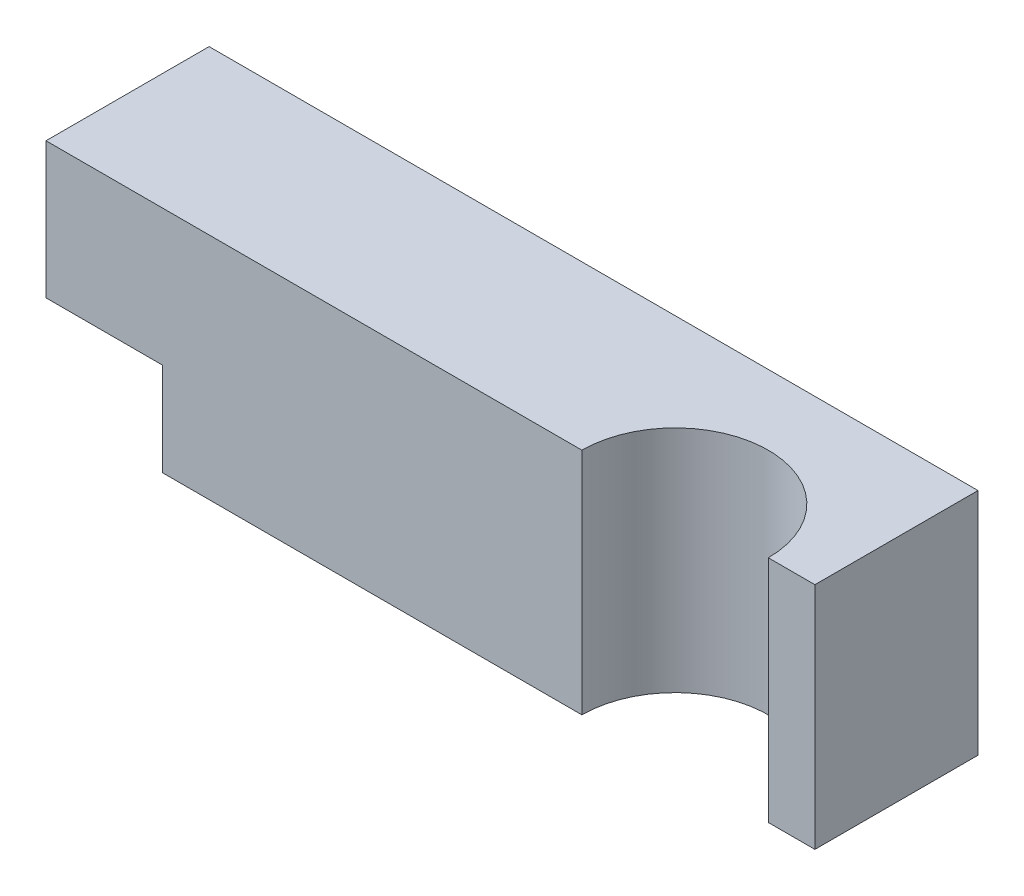
ISO-10303-21;
HEADER;
FILE_DESCRIPTION(('STEP AP214'),'2;1');
FILE_NAME('part.step','',(''),(''),'','','');
FILE_SCHEMA(('AUTOMOTIVE_DESIGN { 1 0 10303 214 1 1 1 1 }'));
ENDSEC;
DATA;
#1=APPLICATION_CONTEXT('core data for automotive mechanical design processes');
#2=APPLICATION_PROTOCOL_DEFINITION('international standard','automotive_design',2000,#1);
#3=PRODUCT_CONTEXT('',#1,'mechanical');
#4=PRODUCT('Part','Part','',(#3));
#5=PRODUCT_RELATED_PRODUCT_CATEGORY('part','',(#4));
#6=PRODUCT_DEFINITION_FORMATION('','',#4);
#7=PRODUCT_DEFINITION_CONTEXT('part definition',#1,'design');
#8=PRODUCT_DEFINITION('design','',#6,#7);
#9=PRODUCT_DEFINITION_SHAPE('','',#8);
#10=(LENGTH_UNIT() NAMED_UNIT(*) SI_UNIT(.MILLI.,.METRE.));
#11=(NAMED_UNIT(*) PLANE_ANGLE_UNIT() SI_UNIT($,.RADIAN.));
#12=(NAMED_UNIT(*) SI_UNIT($,.STERADIAN.) SOLID_ANGLE_UNIT());
#13=UNCERTAINTY_MEASURE_WITH_UNIT(LENGTH_MEASURE(1.E-05),#10,'distance_accuracy_value','');
#14=(GEOMETRIC_REPRESENTATION_CONTEXT(3) GLOBAL_UNCERTAINTY_ASSIGNED_CONTEXT((#13)) GLOBAL_UNIT_ASSIGNED_CONTEXT((#10,
#11,#12)) REPRESENTATION_CONTEXT('',''));
#15=CARTESIAN_POINT('',(0.,0.,0.));
#16=DIRECTION('',(0.,0.,1.));
#17=DIRECTION('',(1.,0.,0.));
#18=AXIS2_PLACEMENT_3D('',#15,#16,#17);
#19=CARTESIAN_POINT('',(0.,0.,3.5));
#20=DIRECTION('',(0.,0.,1.));
#21=DIRECTION('',(1.,0.,0.));
#22=AXIS2_PLACEMENT_3D('',#19,#20,#21);
#23=PLANE('',#22);
#24=DIRECTION('',(0.,1.,0.));
#25=VECTOR('',#24,1.);
#26=CARTESIAN_POINT('',(29.8815164360888,13.8846877860004,3.5));
#27=LINE('',#26,#25);
#28=CARTESIAN_POINT('',(29.8815164360888,14.9646877860004,3.5));
#29=VERTEX_POINT('',#28);
#30=CARTESIAN_POINT('',(29.8815164360888,19.8846877860004,3.5));
#31=VERTEX_POINT('',#30);
#32=EDGE_CURVE('E12',#29,#31,#27,.T.);
#33=ORIENTED_EDGE('',*,*,#32,.F.);
#34=DIRECTION('',(-1.,0.,0.));
#35=VECTOR('',#34,1.);
#36=CARTESIAN_POINT('',(30.8815164360888,14.9646877860004,3.5));
#37=LINE('',#36,#35);
#38=CARTESIAN_POINT('',(30.8815164360888,14.9646877860004,3.5));
#39=VERTEX_POINT('',#38);
#40=EDGE_CURVE('E125',#39,#29,#37,.T.);
#41=ORIENTED_EDGE('',*,*,#40,.F.);
#42=DIRECTION('',(0.,-1.,0.));
#43=VECTOR('',#42,1.);
#44=CARTESIAN_POINT('',(30.8815164360888,19.8846877860004,3.5));
#45=LINE('',#44,#43);
#46=CARTESIAN_POINT('',(30.8815164360888,19.8846877860004,3.5));
#47=VERTEX_POINT('',#46);
#48=EDGE_CURVE('E112',#47,#39,#45,.T.);
#49=ORIENTED_EDGE('',*,*,#48,.F.);
#50=DIRECTION('',(-1.,0.,0.));
#51=VECTOR('',#50,1.);
#52=CARTESIAN_POINT('',(20.7026434327298,19.8846877860004,3.5));
#53=LINE('',#52,#51);
#54=EDGE_CURVE('E102',#47,#31,#53,.T.);
#55=ORIENTED_EDGE('',*,*,#54,.T.);
#56=EDGE_LOOP('',(#33,#41,#49,#55));
#57=FACE_BOUND('',#56,.T.);
#58=ADVANCED_FACE('F33',(#57),#23,.T.);
#59=CARTESIAN_POINT('',(16.8815164360888,14.9646877860004,3.5));
#60=DIRECTION('',(-1.,0.,0.));
#61=DIRECTION('',(0.,0.,1.));
#62=AXIS2_PLACEMENT_3D('',#59,#60,#61);
#63=PLANE('',#62);
#64=DIRECTION('',(0.,1.,0.));
#65=VECTOR('',#64,1.);
#66=CARTESIAN_POINT('',(16.8815164360888,14.9646877860004,0.));
#67=LINE('',#66,#65);
#68=CARTESIAN_POINT('',(16.8815164360888,14.9646877860004,0.));
#69=VERTEX_POINT('',#68);
#70=CARTESIAN_POINT('',(16.8815164360888,16.9646877860004,0.));
#71=VERTEX_POINT('',#70);
#72=EDGE_CURVE('E130',#69,#71,#67,.T.);
#73=ORIENTED_EDGE('',*,*,#72,.F.);
#74=DIRECTION('',(0.,0.,-1.));
#75=VECTOR('',#74,1.);
#76=CARTESIAN_POINT('',(16.8815164360888,14.9646877860004,3.5));
#77=LINE('',#76,#75);
#78=CARTESIAN_POINT('',(16.8815164360888,14.9646877860004,3.5));
#79=VERTEX_POINT('',#78);
#80=EDGE_CURVE('E81',#79,#69,#77,.T.);
#81=ORIENTED_EDGE('',*,*,#80,.F.);
#82=DIRECTION('',(0.,1.,0.));
#83=VECTOR('',#82,1.);
#84=CARTESIAN_POINT('',(16.8815164360888,14.9646877860004,3.5));
#85=LINE('',#84,#83);
#86=CARTESIAN_POINT('',(16.8815164360888,16.9646877860004,3.5));
#87=VERTEX_POINT('',#86);
#88=EDGE_CURVE('E146',#79,#87,#85,.T.);
#89=ORIENTED_EDGE('',*,*,#88,.T.);
#90=DIRECTION('',(0.,0.,-1.));
#91=VECTOR('',#90,1.);
#92=CARTESIAN_POINT('',(16.8815164360888,16.9646877860004,3.5));
#93=LINE('',#92,#91);
#94=EDGE_CURVE('E89',#87,#71,#93,.T.);
#95=ORIENTED_EDGE('',*,*,#94,.T.);
#96=EDGE_LOOP('',(#73,#81,#89,#95));
#97=FACE_BOUND('',#96,.T.);
#98=ADVANCED_FACE('F35',(#97),#63,.T.);
#99=CARTESIAN_POINT('',(30.8815164360888,14.9646877860004,3.5));
#100=DIRECTION('',(0.,-1.,0.));
#101=DIRECTION('',(1.,0.,0.));
#102=AXIS2_PLACEMENT_3D('',#99,#100,#101);
#103=PLANE('',#102);
#104=CARTESIAN_POINT('',(27.8815164360888,14.9646877860004,3.5));
#105=DIRECTION('',(0.,-1.,0.));
#106=DIRECTION('',(1.,0.,0.));
#107=AXIS2_PLACEMENT_3D('',#104,#105,#106);
#108=CIRCLE('',#107,2.);
#109=CARTESIAN_POINT('',(25.8815164360888,14.9646877860004,3.5));
#110=VERTEX_POINT('',#109);
#111=EDGE_CURVE('E134',#110,#29,#108,.T.);
#112=ORIENTED_EDGE('',*,*,#111,.F.);
#113=EDGE_CURVE('E56',#110,#79,#37,.T.);
#114=ORIENTED_EDGE('',*,*,#113,.T.);
#115=ORIENTED_EDGE('',*,*,#80,.T.);
#116=DIRECTION('',(-1.,0.,0.));
#117=VECTOR('',#116,1.);
#118=CARTESIAN_POINT('',(30.8815164360888,14.9646877860004,0.));
#119=LINE('',#118,#117);
#120=CARTESIAN_POINT('',(30.8815164360888,14.9646877860004,0.));
#121=VERTEX_POINT('',#120);
#122=EDGE_CURVE('E143',#121,#69,#119,.T.);
#123=ORIENTED_EDGE('',*,*,#122,.F.);
#124=DIRECTION('',(0.,0.,-1.));
#125=VECTOR('',#124,1.);
#126=CARTESIAN_POINT('',(30.8815164360888,14.9646877860004,3.5));
#127=LINE('',#126,#125);
#128=EDGE_CURVE('E120',#39,#121,#127,.T.);
#129=ORIENTED_EDGE('',*,*,#128,.F.);
#130=ORIENTED_EDGE('',*,*,#40,.T.);
#131=EDGE_LOOP('',(#112,#114,#115,#123,#129,#130));
#132=FACE_BOUND('',#131,.T.);
#133=ADVANCED_FACE('F157',(#132),#103,.T.);
#134=CARTESIAN_POINT('',(30.8815164360888,14.9646877860004,3.5));
#135=DIRECTION('',(-1.,0.,0.));
#136=DIRECTION('',(0.,0.,1.));
#137=AXIS2_PLACEMENT_3D('',#134,#135,#136);
#138=PLANE('',#137);
#139=DIRECTION('',(0.,1.,0.));
#140=VECTOR('',#139,1.);
#141=CARTESIAN_POINT('',(30.8815164360888,14.9646877860004,0.));
#142=LINE('',#141,#140);
#143=CARTESIAN_POINT('',(30.8815164360888,19.8846877860004,0.));
#144=VERTEX_POINT('',#143);
#145=EDGE_CURVE('E119',#121,#144,#142,.T.);
#146=ORIENTED_EDGE('',*,*,#145,.T.);
#147=DIRECTION('',(0.,0.,-1.));
#148=VECTOR('',#147,1.);
#149=CARTESIAN_POINT('',(30.8815164360888,19.8846877860004,3.5));
#150=LINE('',#149,#148);
#151=EDGE_CURVE('E105',#47,#144,#150,.T.);
#152=ORIENTED_EDGE('',*,*,#151,.F.);
#153=ORIENTED_EDGE('',*,*,#48,.T.);
#154=ORIENTED_EDGE('',*,*,#128,.T.);
#155=EDGE_LOOP('',(#146,#152,#153,#154));
#156=FACE_BOUND('',#155,.T.);
#157=ADVANCED_FACE('F116',(#156),#138,.F.);
#158=CARTESIAN_POINT('',(20.7026434327298,19.8846877860004,3.5));
#159=DIRECTION('',(0.,1.,0.));
#160=DIRECTION('',(0.,0.,1.));
#161=AXIS2_PLACEMENT_3D('',#158,#159,#160);
#162=PLANE('',#161);
#163=CARTESIAN_POINT('',(27.8815164360888,19.8846877860004,3.5));
#164=DIRECTION('',(0.,1.,0.));
#165=DIRECTION('',(0.,0.,1.));
#166=AXIS2_PLACEMENT_3D('',#163,#164,#165);
#167=CIRCLE('',#166,2.);
#168=CARTESIAN_POINT('',(25.8815164360888,19.8846877860004,3.5));
#169=VERTEX_POINT('',#168);
#170=EDGE_CURVE('E47',#31,#169,#167,.T.);
#171=ORIENTED_EDGE('',*,*,#170,.F.);
#172=ORIENTED_EDGE('',*,*,#54,.F.);
#173=ORIENTED_EDGE('',*,*,#151,.T.);
#174=DIRECTION('',(1.,0.,0.));
#175=VECTOR('',#174,1.);
#176=CARTESIAN_POINT('',(20.7026434327298,19.8846877860004,0.));
#177=LINE('',#176,#175);
#178=CARTESIAN_POINT('',(14.3815164360888,19.8846877860003,0.));
#179=VERTEX_POINT('',#178);
#180=EDGE_CURVE('E140',#179,#144,#177,.T.);
#181=ORIENTED_EDGE('',*,*,#180,.F.);
#182=DIRECTION('',(0.,0.,-1.));
#183=VECTOR('',#182,1.);
#184=CARTESIAN_POINT('',(14.3815164360888,19.8846877860003,3.5));
#185=LINE('',#184,#183);
#186=CARTESIAN_POINT('',(14.3815164360888,19.8846877860003,3.5));
#187=VERTEX_POINT('',#186);
#188=EDGE_CURVE('E121',#187,#179,#185,.T.);
#189=ORIENTED_EDGE('',*,*,#188,.F.);
#190=EDGE_CURVE('E113',#169,#187,#53,.T.);
#191=ORIENTED_EDGE('',*,*,#190,.F.);
#192=EDGE_LOOP('',(#171,#172,#173,#181,#189,#191));
#193=FACE_BOUND('',#192,.T.);
#194=ADVANCED_FACE('F104',(#193),#162,.T.);
#195=CARTESIAN_POINT('',(14.3815164360888,16.9646877860004,3.5));
#196=DIRECTION('',(-1.,0.,0.));
#197=DIRECTION('',(0.,0.,1.));
#198=AXIS2_PLACEMENT_3D('',#195,#196,#197);
#199=PLANE('',#198);
#200=DIRECTION('',(0.,1.,0.));
#201=VECTOR('',#200,1.);
#202=CARTESIAN_POINT('',(14.3815164360888,16.9646877860004,0.));
#203=LINE('',#202,#201);
#204=CARTESIAN_POINT('',(14.3815164360888,16.9646877860004,0.));
#205=VERTEX_POINT('',#204);
#206=EDGE_CURVE('E137',#205,#179,#203,.T.);
#207=ORIENTED_EDGE('',*,*,#206,.F.);
#208=DIRECTION('',(0.,0.,-1.));
#209=VECTOR('',#208,1.);
#210=CARTESIAN_POINT('',(14.3815164360888,16.9646877860004,3.5));
#211=LINE('',#210,#209);
#212=CARTESIAN_POINT('',(14.3815164360888,16.9646877860004,3.5));
#213=VERTEX_POINT('',#212);
#214=EDGE_CURVE('E151',#213,#205,#211,.T.);
#215=ORIENTED_EDGE('',*,*,#214,.F.);
#216=DIRECTION('',(0.,1.,0.));
#217=VECTOR('',#216,1.);
#218=CARTESIAN_POINT('',(14.3815164360888,16.9646877860004,3.5));
#219=LINE('',#218,#217);
#220=EDGE_CURVE('E166',#213,#187,#219,.T.);
#221=ORIENTED_EDGE('',*,*,#220,.T.);
#222=ORIENTED_EDGE('',*,*,#188,.T.);
#223=EDGE_LOOP('',(#207,#215,#221,#222));
#224=FACE_BOUND('',#223,.T.);
#225=ADVANCED_FACE('F173',(#224),#199,.T.);
#226=CARTESIAN_POINT('',(16.8815164360888,16.9646877860004,3.5));
#227=DIRECTION('',(0.,-1.,0.));
#228=DIRECTION('',(1.,0.,0.));
#229=AXIS2_PLACEMENT_3D('',#226,#227,#228);
#230=PLANE('',#229);
#231=DIRECTION('',(-1.,0.,0.));
#232=VECTOR('',#231,1.);
#233=CARTESIAN_POINT('',(16.8815164360888,16.9646877860004,0.));
#234=LINE('',#233,#232);
#235=EDGE_CURVE('E133',#71,#205,#234,.T.);
#236=ORIENTED_EDGE('',*,*,#235,.F.);
#237=ORIENTED_EDGE('',*,*,#94,.F.);
#238=DIRECTION('',(-1.,0.,0.));
#239=VECTOR('',#238,1.);
#240=CARTESIAN_POINT('',(16.8815164360888,16.9646877860004,3.5));
#241=LINE('',#240,#239);
#242=EDGE_CURVE('E163',#87,#213,#241,.T.);
#243=ORIENTED_EDGE('',*,*,#242,.T.);
#244=ORIENTED_EDGE('',*,*,#214,.T.);
#245=EDGE_LOOP('',(#236,#237,#243,#244));
#246=FACE_BOUND('',#245,.T.);
#247=ADVANCED_FACE('F176',(#246),#230,.T.);
#248=DIRECTION('',(0.,1.,0.));
#249=VECTOR('',#248,1.);
#250=CARTESIAN_POINT('',(25.8815164360888,13.8846877860004,3.5));
#251=LINE('',#250,#249);
#252=EDGE_CURVE('E41',#169,#110,#251,.F.);
#253=ORIENTED_EDGE('',*,*,#252,.F.);
#254=ORIENTED_EDGE('',*,*,#190,.T.);
#255=ORIENTED_EDGE('',*,*,#220,.F.);
#256=ORIENTED_EDGE('',*,*,#242,.F.);
#257=ORIENTED_EDGE('',*,*,#88,.F.);
#258=ORIENTED_EDGE('',*,*,#113,.F.);
#259=EDGE_LOOP('',(#253,#254,#255,#256,#257,#258));
#260=FACE_BOUND('',#259,.T.);
#261=ADVANCED_FACE('F160',(#260),#23,.T.);
#262=CARTESIAN_POINT('',(0.,0.,0.));
#263=DIRECTION('',(0.,0.,1.));
#264=DIRECTION('',(1.,0.,0.));
#265=AXIS2_PLACEMENT_3D('',#262,#263,#264);
#266=PLANE('',#265);
#267=ORIENTED_EDGE('',*,*,#72,.T.);
#268=ORIENTED_EDGE('',*,*,#235,.T.);
#269=ORIENTED_EDGE('',*,*,#206,.T.);
#270=ORIENTED_EDGE('',*,*,#180,.T.);
#271=ORIENTED_EDGE('',*,*,#145,.F.);
#272=ORIENTED_EDGE('',*,*,#122,.T.);
#273=EDGE_LOOP('',(#267,#268,#269,#270,#271,#272));
#274=FACE_BOUND('',#273,.T.);
#275=ADVANCED_FACE('F175',(#274),#266,.F.);
#276=CARTESIAN_POINT('',(27.8815164360888,13.8846877860004,3.5));
#277=DIRECTION('',(0.,1.,0.));
#278=DIRECTION('',(0.,0.,1.));
#279=AXIS2_PLACEMENT_3D('',#276,#277,#278);
#280=CYLINDRICAL_SURFACE('',#279,2.);
#281=ORIENTED_EDGE('',*,*,#111,.T.);
#282=ORIENTED_EDGE('',*,*,#32,.T.);
#283=ORIENTED_EDGE('',*,*,#170,.T.);
#284=ORIENTED_EDGE('',*,*,#252,.T.);
#285=EDGE_LOOP('',(#281,#282,#283,#284));
#286=FACE_BOUND('',#285,.T.);
#287=ADVANCED_FACE('F154',(#286),#280,.F.);
#288=CLOSED_SHELL('',(#58,#98,#133,#157,#194,#225,#247,#261,#275,#287));
#289=MANIFOLD_SOLID_BREP('B2',#288);
#290=ADVANCED_BREP_SHAPE_REPRESENTATION('',(#18,#289),#14);
#291=SHAPE_DEFINITION_REPRESENTATION(#9,#290);
ENDSEC;
END-ISO-10303-21;
